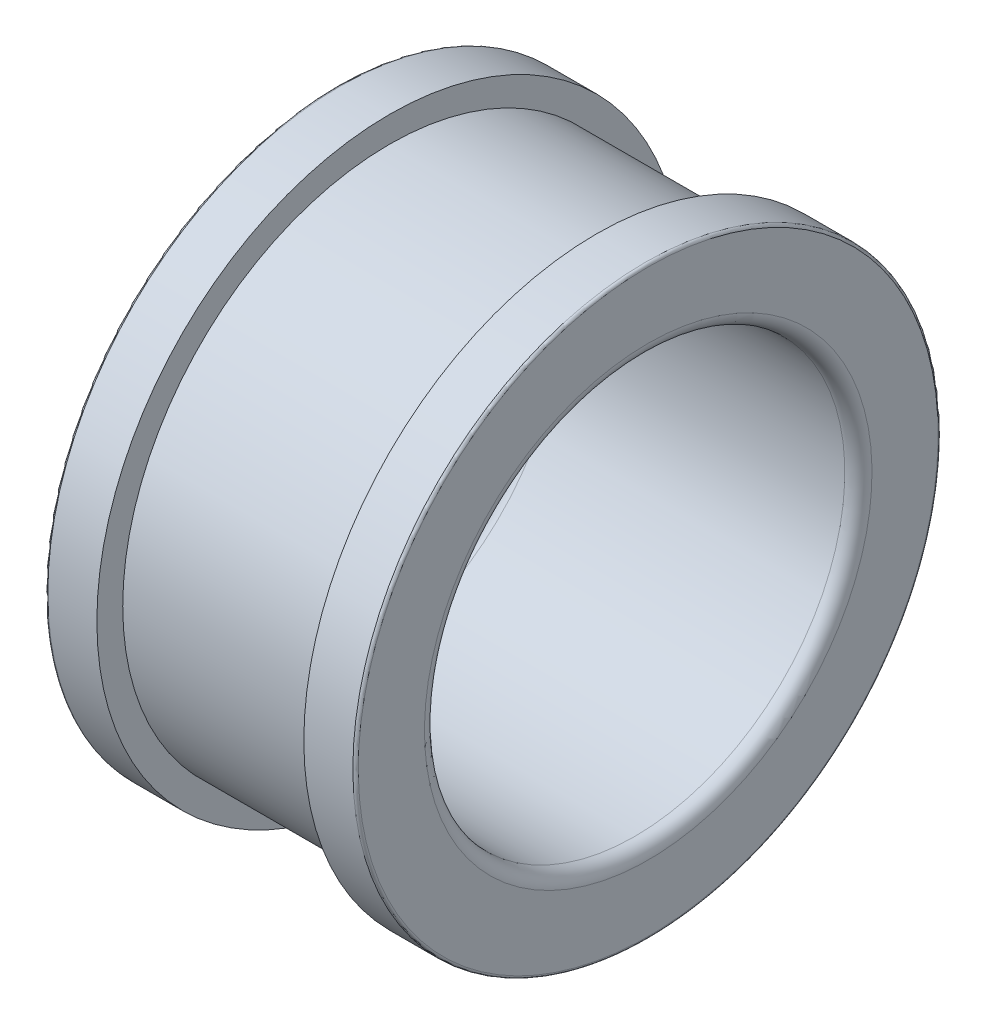
ISO-10303-21;
HEADER;
FILE_DESCRIPTION(('STEP AP214'),'2;1');
FILE_NAME('part.step','',(''),(''),'','','');
FILE_SCHEMA(('AUTOMOTIVE_DESIGN { 1 0 10303 214 1 1 1 1 }'));
ENDSEC;
DATA;
#1=APPLICATION_CONTEXT('core data for automotive mechanical design processes');
#2=APPLICATION_PROTOCOL_DEFINITION('international standard','automotive_design',2000,#1);
#3=PRODUCT_CONTEXT('',#1,'mechanical');
#4=PRODUCT('Part','Part','',(#3));
#5=PRODUCT_RELATED_PRODUCT_CATEGORY('part','',(#4));
#6=PRODUCT_DEFINITION_FORMATION('','',#4);
#7=PRODUCT_DEFINITION_CONTEXT('part definition',#1,'design');
#8=PRODUCT_DEFINITION('design','',#6,#7);
#9=PRODUCT_DEFINITION_SHAPE('','',#8);
#10=(LENGTH_UNIT() NAMED_UNIT(*) SI_UNIT(.MILLI.,.METRE.));
#11=(NAMED_UNIT(*) PLANE_ANGLE_UNIT() SI_UNIT($,.RADIAN.));
#12=(NAMED_UNIT(*) SI_UNIT($,.STERADIAN.) SOLID_ANGLE_UNIT());
#13=UNCERTAINTY_MEASURE_WITH_UNIT(LENGTH_MEASURE(1.E-05),#10,'distance_accuracy_value','');
#14=(GEOMETRIC_REPRESENTATION_CONTEXT(3) GLOBAL_UNCERTAINTY_ASSIGNED_CONTEXT((#13)) GLOBAL_UNIT_ASSIGNED_CONTEXT((#10,
#11,#12)) REPRESENTATION_CONTEXT('',''));
#15=CARTESIAN_POINT('',(0.,0.,0.));
#16=DIRECTION('',(0.,0.,1.));
#17=DIRECTION('',(1.,0.,0.));
#18=AXIS2_PLACEMENT_3D('',#15,#16,#17);
#19=CARTESIAN_POINT('',(43.79,0.,0.));
#20=DIRECTION('',(-1.,0.,0.));
#21=DIRECTION('',(0.,1.,0.));
#22=AXIS2_PLACEMENT_3D('',#19,#20,#21);
#23=CYLINDRICAL_SURFACE('',#22,45.25);
#24=CARTESIAN_POINT('',(40.,0.,0.));
#25=DIRECTION('',(1.,0.,0.));
#26=DIRECTION('',(0.,1.,0.));
#27=AXIS2_PLACEMENT_3D('',#24,#25,#26);
#28=CIRCLE('',#27,45.25);
#29=CARTESIAN_POINT('',(40.,45.25,0.));
#30=VERTEX_POINT('',#29);
#31=EDGE_CURVE('E11',#30,#30,#28,.T.);
#32=ORIENTED_EDGE('',*,*,#31,.T.);
#33=EDGE_LOOP('',(#32));
#34=FACE_BOUND('',#33,.T.);
#35=CARTESIAN_POINT('',(47.58,0.,0.));
#36=DIRECTION('',(1.,0.,0.));
#37=DIRECTION('',(0.,1.,0.));
#38=AXIS2_PLACEMENT_3D('',#35,#36,#37);
#39=CIRCLE('',#38,45.25);
#40=CARTESIAN_POINT('',(47.58,45.25,0.));
#41=VERTEX_POINT('',#40);
#42=EDGE_CURVE('E74',#41,#41,#39,.T.);
#43=ORIENTED_EDGE('',*,*,#42,.F.);
#44=EDGE_LOOP('',(#43));
#45=FACE_BOUND('',#44,.T.);
#46=ADVANCED_FACE('F19',(#34,#45),#23,.T.);
#47=CARTESIAN_POINT('',(40.,43.25,0.));
#48=DIRECTION('',(-1.,0.,0.));
#49=DIRECTION('',(0.,-1.,0.));
#50=AXIS2_PLACEMENT_3D('',#47,#48,#49);
#51=PLANE('',#50);
#52=CARTESIAN_POINT('',(40.,0.,0.));
#53=DIRECTION('',(1.,0.,0.));
#54=DIRECTION('',(0.,1.,0.));
#55=AXIS2_PLACEMENT_3D('',#52,#53,#54);
#56=CIRCLE('',#55,41.25);
#57=CARTESIAN_POINT('',(40.,41.25,0.));
#58=VERTEX_POINT('',#57);
#59=EDGE_CURVE('E29',#58,#58,#56,.T.);
#60=ORIENTED_EDGE('',*,*,#59,.T.);
#61=EDGE_LOOP('',(#60));
#62=FACE_BOUND('',#61,.T.);
#63=ORIENTED_EDGE('',*,*,#31,.F.);
#64=EDGE_LOOP('',(#63));
#65=FACE_BOUND('',#64,.T.);
#66=ADVANCED_FACE('F113',(#62,#65),#51,.T.);
#67=CARTESIAN_POINT('',(24.,0.,0.));
#68=DIRECTION('',(-1.,0.,0.));
#69=DIRECTION('',(0.,1.,0.));
#70=AXIS2_PLACEMENT_3D('',#67,#68,#69);
#71=CYLINDRICAL_SURFACE('',#70,41.25);
#72=CARTESIAN_POINT('',(8.,0.,0.));
#73=DIRECTION('',(1.,0.,0.));
#74=DIRECTION('',(0.,1.,0.));
#75=AXIS2_PLACEMENT_3D('',#72,#73,#74);
#76=CIRCLE('',#75,41.25);
#77=CARTESIAN_POINT('',(8.,41.25,0.));
#78=VERTEX_POINT('',#77);
#79=EDGE_CURVE('E79',#78,#78,#76,.T.);
#80=ORIENTED_EDGE('',*,*,#79,.T.);
#81=EDGE_LOOP('',(#80));
#82=FACE_BOUND('',#81,.T.);
#83=ORIENTED_EDGE('',*,*,#59,.F.);
#84=EDGE_LOOP('',(#83));
#85=FACE_BOUND('',#84,.T.);
#86=ADVANCED_FACE('F109',(#82,#85),#71,.T.);
#87=CARTESIAN_POINT('',(8.,43.25,0.));
#88=DIRECTION('',(1.,0.,0.));
#89=DIRECTION('',(0.,1.,0.));
#90=AXIS2_PLACEMENT_3D('',#87,#88,#89);
#91=PLANE('',#90);
#92=CARTESIAN_POINT('',(8.,0.,0.));
#93=DIRECTION('',(1.,0.,0.));
#94=DIRECTION('',(0.,1.,0.));
#95=AXIS2_PLACEMENT_3D('',#92,#93,#94);
#96=CIRCLE('',#95,45.25);
#97=CARTESIAN_POINT('',(8.,45.25,0.));
#98=VERTEX_POINT('',#97);
#99=EDGE_CURVE('E86',#98,#98,#96,.T.);
#100=ORIENTED_EDGE('',*,*,#99,.T.);
#101=EDGE_LOOP('',(#100));
#102=FACE_BOUND('',#101,.T.);
#103=ORIENTED_EDGE('',*,*,#79,.F.);
#104=EDGE_LOOP('',(#103));
#105=FACE_BOUND('',#104,.T.);
#106=ADVANCED_FACE('F93',(#102,#105),#91,.T.);
#107=CARTESIAN_POINT('',(4.21,0.,0.));
#108=DIRECTION('',(-1.,0.,0.));
#109=DIRECTION('',(0.,1.,0.));
#110=AXIS2_PLACEMENT_3D('',#107,#108,#109);
#111=CYLINDRICAL_SURFACE('',#110,45.25);
#112=CARTESIAN_POINT('',(0.42,0.,0.));
#113=DIRECTION('',(1.,0.,0.));
#114=DIRECTION('',(0.,1.,0.));
#115=AXIS2_PLACEMENT_3D('',#112,#113,#114);
#116=CIRCLE('',#115,45.25);
#117=CARTESIAN_POINT('',(0.42,45.25,0.));
#118=VERTEX_POINT('',#117);
#119=EDGE_CURVE('E83',#118,#118,#116,.T.);
#120=ORIENTED_EDGE('',*,*,#119,.T.);
#121=EDGE_LOOP('',(#120));
#122=FACE_BOUND('',#121,.T.);
#123=ORIENTED_EDGE('',*,*,#99,.F.);
#124=EDGE_LOOP('',(#123));
#125=FACE_BOUND('',#124,.T.);
#126=ADVANCED_FACE('F96',(#122,#125),#111,.T.);
#127=CARTESIAN_POINT('',(0.42,0.,0.));
#128=DIRECTION('',(1.,0.,0.));
#129=DIRECTION('',(0.,0.,-1.));
#130=AXIS2_PLACEMENT_3D('',#127,#128,#129);
#131=TOROIDAL_SURFACE('',#130,44.83,0.42);
#132=CARTESIAN_POINT('',(0.,0.,0.));
#133=DIRECTION('',(1.,0.,0.));
#134=DIRECTION('',(0.,1.,0.));
#135=AXIS2_PLACEMENT_3D('',#132,#133,#134);
#136=CIRCLE('',#135,44.83);
#137=CARTESIAN_POINT('',(0.,44.83,0.));
#138=VERTEX_POINT('',#137);
#139=EDGE_CURVE('E82',#138,#138,#136,.T.);
#140=ORIENTED_EDGE('',*,*,#139,.T.);
#141=EDGE_LOOP('',(#140));
#142=FACE_BOUND('',#141,.T.);
#143=ORIENTED_EDGE('',*,*,#119,.F.);
#144=EDGE_LOOP('',(#143));
#145=FACE_BOUND('',#144,.T.);
#146=ADVANCED_FACE('F98',(#142,#145),#131,.T.);
#147=CARTESIAN_POINT('',(0.,39.715,0.));
#148=DIRECTION('',(-1.,0.,0.));
#149=DIRECTION('',(0.,-1.,0.));
#150=AXIS2_PLACEMENT_3D('',#147,#148,#149);
#151=PLANE('',#150);
#152=CARTESIAN_POINT('',(0.,0.,0.));
#153=DIRECTION('',(1.,0.,0.));
#154=DIRECTION('',(0.,1.,0.));
#155=AXIS2_PLACEMENT_3D('',#152,#153,#154);
#156=CIRCLE('',#155,34.6);
#157=CARTESIAN_POINT('',(0.,34.6,0.));
#158=VERTEX_POINT('',#157);
#159=EDGE_CURVE('E54',#158,#158,#156,.T.);
#160=ORIENTED_EDGE('',*,*,#159,.T.);
#161=EDGE_LOOP('',(#160));
#162=FACE_BOUND('',#161,.T.);
#163=ORIENTED_EDGE('',*,*,#139,.F.);
#164=EDGE_LOOP('',(#163));
#165=FACE_BOUND('',#164,.T.);
#166=ADVANCED_FACE('F106',(#162,#165),#151,.T.);
#167=CARTESIAN_POINT('',(2.1,0.,0.));
#168=DIRECTION('',(1.,0.,0.));
#169=DIRECTION('',(0.,0.,-1.));
#170=AXIS2_PLACEMENT_3D('',#167,#168,#169);
#171=TOROIDAL_SURFACE('',#170,34.6,2.1);
#172=CARTESIAN_POINT('',(2.1,0.,0.));
#173=DIRECTION('',(1.,0.,0.));
#174=DIRECTION('',(0.,1.,0.));
#175=AXIS2_PLACEMENT_3D('',#172,#173,#174);
#176=CIRCLE('',#175,32.5);
#177=CARTESIAN_POINT('',(2.1,32.5,0.));
#178=VERTEX_POINT('',#177);
#179=EDGE_CURVE('E23',#178,#178,#176,.T.);
#180=ORIENTED_EDGE('',*,*,#179,.T.);
#181=EDGE_LOOP('',(#180));
#182=FACE_BOUND('',#181,.T.);
#183=ORIENTED_EDGE('',*,*,#159,.F.);
#184=EDGE_LOOP('',(#183));
#185=FACE_BOUND('',#184,.T.);
#186=ADVANCED_FACE('F21',(#182,#185),#171,.T.);
#187=CARTESIAN_POINT('',(24.,0.,0.));
#188=DIRECTION('',(-1.,0.,0.));
#189=DIRECTION('',(0.,1.,0.));
#190=AXIS2_PLACEMENT_3D('',#187,#188,#189);
#191=CYLINDRICAL_SURFACE('',#190,32.5);
#192=CARTESIAN_POINT('',(45.9,0.,0.));
#193=DIRECTION('',(1.,0.,0.));
#194=DIRECTION('',(0.,1.,0.));
#195=AXIS2_PLACEMENT_3D('',#192,#193,#194);
#196=CIRCLE('',#195,32.5);
#197=CARTESIAN_POINT('',(45.9,32.5,0.));
#198=VERTEX_POINT('',#197);
#199=EDGE_CURVE('E73',#198,#198,#196,.T.);
#200=ORIENTED_EDGE('',*,*,#199,.T.);
#201=EDGE_LOOP('',(#200));
#202=FACE_BOUND('',#201,.T.);
#203=ORIENTED_EDGE('',*,*,#179,.F.);
#204=EDGE_LOOP('',(#203));
#205=FACE_BOUND('',#204,.T.);
#206=ADVANCED_FACE('F129',(#202,#205),#191,.F.);
#207=CARTESIAN_POINT('',(45.9,0.,0.));
#208=DIRECTION('',(1.,0.,0.));
#209=DIRECTION('',(0.,0.,-1.));
#210=AXIS2_PLACEMENT_3D('',#207,#208,#209);
#211=TOROIDAL_SURFACE('',#210,34.6,2.1);
#212=CARTESIAN_POINT('',(48.,0.,0.));
#213=DIRECTION('',(1.,0.,0.));
#214=DIRECTION('',(0.,1.,0.));
#215=AXIS2_PLACEMENT_3D('',#212,#213,#214);
#216=CIRCLE('',#215,34.6);
#217=CARTESIAN_POINT('',(48.,34.6,0.));
#218=VERTEX_POINT('',#217);
#219=EDGE_CURVE('E69',#218,#218,#216,.T.);
#220=ORIENTED_EDGE('',*,*,#219,.T.);
#221=EDGE_LOOP('',(#220));
#222=FACE_BOUND('',#221,.T.);
#223=ORIENTED_EDGE('',*,*,#199,.F.);
#224=EDGE_LOOP('',(#223));
#225=FACE_BOUND('',#224,.T.);
#226=ADVANCED_FACE('F70',(#222,#225),#211,.T.);
#227=CARTESIAN_POINT('',(48.,39.715,0.));
#228=DIRECTION('',(1.,0.,0.));
#229=DIRECTION('',(0.,1.,0.));
#230=AXIS2_PLACEMENT_3D('',#227,#228,#229);
#231=PLANE('',#230);
#232=CARTESIAN_POINT('',(48.,0.,0.));
#233=DIRECTION('',(1.,0.,0.));
#234=DIRECTION('',(0.,1.,0.));
#235=AXIS2_PLACEMENT_3D('',#232,#233,#234);
#236=CIRCLE('',#235,44.83);
#237=CARTESIAN_POINT('',(48.,44.83,0.));
#238=VERTEX_POINT('',#237);
#239=EDGE_CURVE('E76',#238,#238,#236,.T.);
#240=ORIENTED_EDGE('',*,*,#239,.T.);
#241=EDGE_LOOP('',(#240));
#242=FACE_BOUND('',#241,.T.);
#243=ORIENTED_EDGE('',*,*,#219,.F.);
#244=EDGE_LOOP('',(#243));
#245=FACE_BOUND('',#244,.T.);
#246=ADVANCED_FACE('F122',(#242,#245),#231,.T.);
#247=CARTESIAN_POINT('',(47.58,0.,0.));
#248=DIRECTION('',(1.,0.,0.));
#249=DIRECTION('',(0.,0.,-1.));
#250=AXIS2_PLACEMENT_3D('',#247,#248,#249);
#251=TOROIDAL_SURFACE('',#250,44.83,0.42);
#252=ORIENTED_EDGE('',*,*,#42,.T.);
#253=EDGE_LOOP('',(#252));
#254=FACE_BOUND('',#253,.T.);
#255=ORIENTED_EDGE('',*,*,#239,.F.);
#256=EDGE_LOOP('',(#255));
#257=FACE_BOUND('',#256,.T.);
#258=ADVANCED_FACE('F125',(#254,#257),#251,.T.);
#259=CLOSED_SHELL('',(#46,#66,#86,#106,#126,#146,#166,#186,#206,#226,#246,#258));
#260=MANIFOLD_SOLID_BREP('B1',#259);
#261=ADVANCED_BREP_SHAPE_REPRESENTATION('',(#18,#260),#14);
#262=SHAPE_DEFINITION_REPRESENTATION(#9,#261);
ENDSEC;
END-ISO-10303-21;
